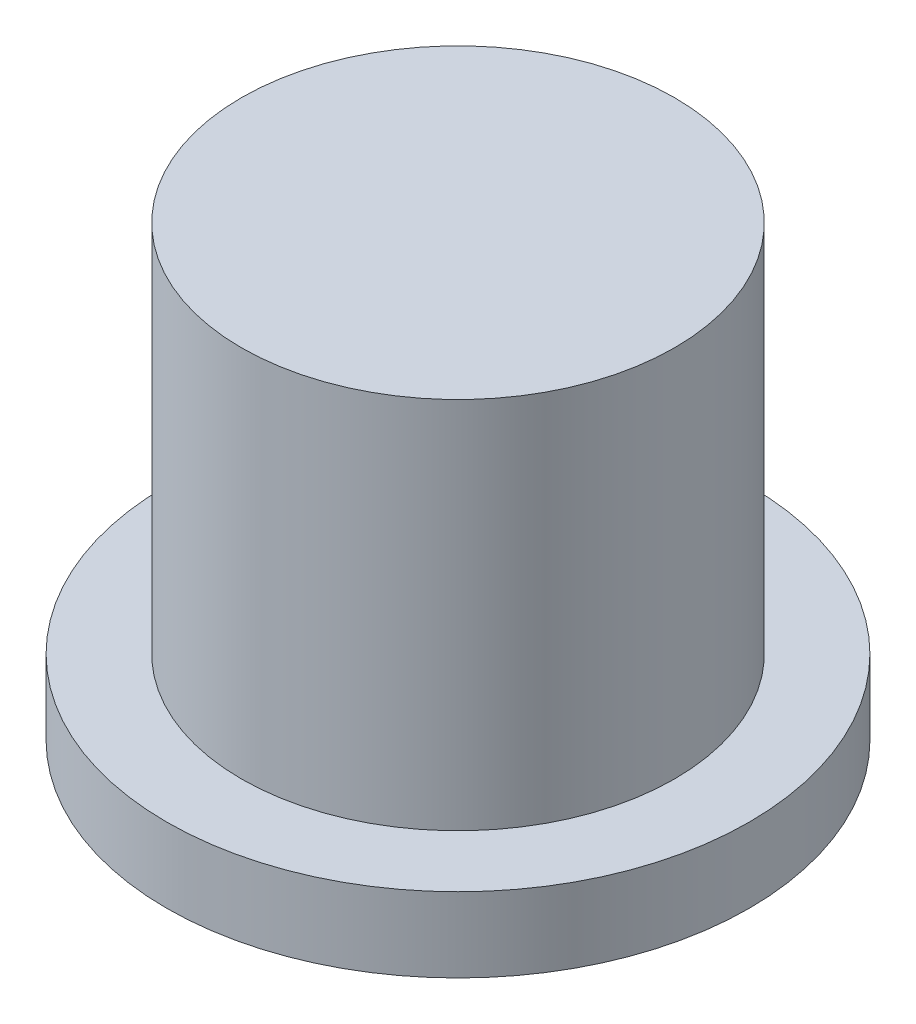
ISO-10303-21;
HEADER;
FILE_DESCRIPTION(('STEP AP214'),'2;1');
FILE_NAME('part.step','',(''),(''),'','','');
FILE_SCHEMA(('AUTOMOTIVE_DESIGN { 1 0 10303 214 1 1 1 1 }'));
ENDSEC;
DATA;
#1=APPLICATION_CONTEXT('core data for automotive mechanical design processes');
#2=APPLICATION_PROTOCOL_DEFINITION('international standard','automotive_design',2000,#1);
#3=PRODUCT_CONTEXT('',#1,'mechanical');
#4=PRODUCT('Part','Part','',(#3));
#5=PRODUCT_RELATED_PRODUCT_CATEGORY('part','',(#4));
#6=PRODUCT_DEFINITION_FORMATION('','',#4);
#7=PRODUCT_DEFINITION_CONTEXT('part definition',#1,'design');
#8=PRODUCT_DEFINITION('design','',#6,#7);
#9=PRODUCT_DEFINITION_SHAPE('','',#8);
#10=(LENGTH_UNIT() NAMED_UNIT(*) SI_UNIT(.MILLI.,.METRE.));
#11=(NAMED_UNIT(*) PLANE_ANGLE_UNIT() SI_UNIT($,.RADIAN.));
#12=(NAMED_UNIT(*) SI_UNIT($,.STERADIAN.) SOLID_ANGLE_UNIT());
#13=UNCERTAINTY_MEASURE_WITH_UNIT(LENGTH_MEASURE(1.E-05),#10,'distance_accuracy_value','');
#14=(GEOMETRIC_REPRESENTATION_CONTEXT(3) GLOBAL_UNCERTAINTY_ASSIGNED_CONTEXT((#13)) GLOBAL_UNIT_ASSIGNED_CONTEXT((#10,
#11,#12)) REPRESENTATION_CONTEXT('',''));
#15=CARTESIAN_POINT('',(0.,0.,0.));
#16=DIRECTION('',(0.,0.,1.));
#17=DIRECTION('',(1.,0.,0.));
#18=AXIS2_PLACEMENT_3D('',#15,#16,#17);
#19=CARTESIAN_POINT('',(0.,0.,0.));
#20=DIRECTION('',(0.,1.,0.));
#21=DIRECTION('',(0.,0.,1.));
#22=AXIS2_PLACEMENT_3D('',#19,#20,#21);
#23=PLANE('',#22);
#24=CARTESIAN_POINT('',(0.,0.,0.));
#25=DIRECTION('',(0.,1.,0.));
#26=DIRECTION('',(0.,0.,1.));
#27=AXIS2_PLACEMENT_3D('',#24,#25,#26);
#28=CIRCLE('',#27,1.9);
#29=CARTESIAN_POINT('',(0.,0.,1.9));
#30=VERTEX_POINT('',#29);
#31=EDGE_CURVE('E11',#30,#30,#28,.T.);
#32=ORIENTED_EDGE('',*,*,#31,.T.);
#33=EDGE_LOOP('',(#32));
#34=FACE_BOUND('',#33,.T.);
#35=CARTESIAN_POINT('',(0.,0.,0.));
#36=DIRECTION('',(0.,1.,0.));
#37=DIRECTION('',(0.,0.,1.));
#38=AXIS2_PLACEMENT_3D('',#35,#36,#37);
#39=CIRCLE('',#38,3.9);
#40=CARTESIAN_POINT('',(0.,0.,3.9));
#41=VERTEX_POINT('',#40);
#42=EDGE_CURVE('E70',#41,#41,#39,.T.);
#43=ORIENTED_EDGE('',*,*,#42,.F.);
#44=EDGE_LOOP('',(#43));
#45=FACE_BOUND('',#44,.T.);
#46=ADVANCED_FACE('F49',(#34,#45),#23,.F.);
#47=CARTESIAN_POINT('',(0.,5.,0.));
#48=DIRECTION('',(0.,-1.,0.));
#49=DIRECTION('',(0.,0.,-1.));
#50=AXIS2_PLACEMENT_3D('',#47,#48,#49);
#51=CYLINDRICAL_SURFACE('',#50,1.9);
#52=CARTESIAN_POINT('',(0.,5.,0.));
#53=DIRECTION('',(0.,1.,0.));
#54=DIRECTION('',(0.,0.,1.));
#55=AXIS2_PLACEMENT_3D('',#52,#53,#54);
#56=CIRCLE('',#55,1.9);
#57=CARTESIAN_POINT('',(0.,5.,1.9));
#58=VERTEX_POINT('',#57);
#59=EDGE_CURVE('E56',#58,#58,#56,.T.);
#60=ORIENTED_EDGE('',*,*,#59,.T.);
#61=EDGE_LOOP('',(#60));
#62=FACE_BOUND('',#61,.T.);
#63=ORIENTED_EDGE('',*,*,#31,.F.);
#64=EDGE_LOOP('',(#63));
#65=FACE_BOUND('',#64,.T.);
#66=ADVANCED_FACE('F87',(#62,#65),#51,.F.);
#67=CARTESIAN_POINT('',(0.,5.,0.));
#68=DIRECTION('',(0.,1.,0.));
#69=DIRECTION('',(0.,0.,1.));
#70=AXIS2_PLACEMENT_3D('',#67,#68,#69);
#71=PLANE('',#70);
#72=ORIENTED_EDGE('',*,*,#59,.F.);
#73=EDGE_LOOP('',(#72));
#74=FACE_BOUND('',#73,.T.);
#75=ADVANCED_FACE('F91',(#74),#71,.F.);
#76=CARTESIAN_POINT('',(0.,1.,0.));
#77=DIRECTION('',(0.,1.,0.));
#78=DIRECTION('',(0.,0.,1.));
#79=AXIS2_PLACEMENT_3D('',#76,#77,#78);
#80=PLANE('',#79);
#81=CARTESIAN_POINT('',(0.,1.,0.));
#82=DIRECTION('',(0.,1.,0.));
#83=DIRECTION('',(0.,0.,1.));
#84=AXIS2_PLACEMENT_3D('',#81,#82,#83);
#85=CIRCLE('',#84,3.9);
#86=CARTESIAN_POINT('',(0.,1.,3.9));
#87=VERTEX_POINT('',#86);
#88=EDGE_CURVE('E69',#87,#87,#85,.T.);
#89=ORIENTED_EDGE('',*,*,#88,.T.);
#90=EDGE_LOOP('',(#89));
#91=FACE_BOUND('',#90,.T.);
#92=CARTESIAN_POINT('',(0.,1.,0.));
#93=DIRECTION('',(0.,1.,0.));
#94=DIRECTION('',(0.,0.,1.));
#95=AXIS2_PLACEMENT_3D('',#92,#93,#94);
#96=CIRCLE('',#95,2.9);
#97=CARTESIAN_POINT('',(0.,1.,2.9));
#98=VERTEX_POINT('',#97);
#99=EDGE_CURVE('E64',#98,#98,#96,.T.);
#100=ORIENTED_EDGE('',*,*,#99,.F.);
#101=EDGE_LOOP('',(#100));
#102=FACE_BOUND('',#101,.T.);
#103=ADVANCED_FACE('F76',(#91,#102),#80,.T.);
#104=CARTESIAN_POINT('',(0.,1.,0.));
#105=DIRECTION('',(0.,-1.,0.));
#106=DIRECTION('',(0.,0.,-1.));
#107=AXIS2_PLACEMENT_3D('',#104,#105,#106);
#108=CYLINDRICAL_SURFACE('',#107,3.9);
#109=ORIENTED_EDGE('',*,*,#88,.F.);
#110=EDGE_LOOP('',(#109));
#111=FACE_BOUND('',#110,.T.);
#112=ORIENTED_EDGE('',*,*,#42,.T.);
#113=EDGE_LOOP('',(#112));
#114=FACE_BOUND('',#113,.T.);
#115=ADVANCED_FACE('F79',(#111,#114),#108,.T.);
#116=CARTESIAN_POINT('',(0.,6.,0.));
#117=DIRECTION('',(0.,1.,0.));
#118=DIRECTION('',(0.,0.,1.));
#119=AXIS2_PLACEMENT_3D('',#116,#117,#118);
#120=PLANE('',#119);
#121=CARTESIAN_POINT('',(0.,6.,0.));
#122=DIRECTION('',(0.,1.,0.));
#123=DIRECTION('',(0.,0.,1.));
#124=AXIS2_PLACEMENT_3D('',#121,#122,#123);
#125=CIRCLE('',#124,2.9);
#126=CARTESIAN_POINT('',(0.,6.,2.9));
#127=VERTEX_POINT('',#126);
#128=EDGE_CURVE('E60',#127,#127,#125,.T.);
#129=ORIENTED_EDGE('',*,*,#128,.T.);
#130=EDGE_LOOP('',(#129));
#131=FACE_BOUND('',#130,.T.);
#132=ADVANCED_FACE('F82',(#131),#120,.T.);
#133=CARTESIAN_POINT('',(0.,5.,0.));
#134=DIRECTION('',(0.,-1.,0.));
#135=DIRECTION('',(0.,0.,-1.));
#136=AXIS2_PLACEMENT_3D('',#133,#134,#135);
#137=CYLINDRICAL_SURFACE('',#136,2.9);
#138=ORIENTED_EDGE('',*,*,#99,.T.);
#139=EDGE_LOOP('',(#138));
#140=FACE_BOUND('',#139,.T.);
#141=ORIENTED_EDGE('',*,*,#128,.F.);
#142=EDGE_LOOP('',(#141));
#143=FACE_BOUND('',#142,.T.);
#144=ADVANCED_FACE('F51',(#140,#143),#137,.T.);
#145=CLOSED_SHELL('',(#46,#66,#75,#103,#115,#132,#144));
#146=MANIFOLD_SOLID_BREP('B2',#145);
#147=ADVANCED_BREP_SHAPE_REPRESENTATION('',(#18,#146),#14);
#148=SHAPE_DEFINITION_REPRESENTATION(#9,#147);
ENDSEC;
END-ISO-10303-21;
